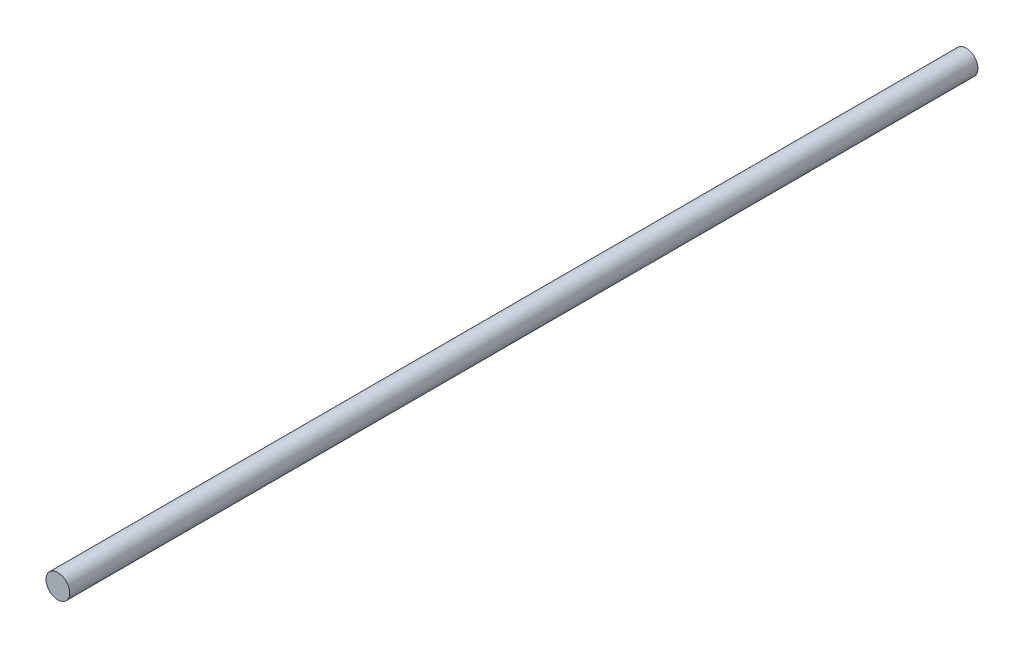
ISO-10303-21;
HEADER;
FILE_DESCRIPTION(('STEP AP214'),'2;1');
FILE_NAME('part.step','',(''),(''),'','','');
FILE_SCHEMA(('AUTOMOTIVE_DESIGN { 1 0 10303 214 1 1 1 1 }'));
ENDSEC;
DATA;
#1=APPLICATION_CONTEXT('core data for automotive mechanical design processes');
#2=APPLICATION_PROTOCOL_DEFINITION('international standard','automotive_design',2000,#1);
#3=PRODUCT_CONTEXT('',#1,'mechanical');
#4=PRODUCT('Part','Part','',(#3));
#5=PRODUCT_RELATED_PRODUCT_CATEGORY('part','',(#4));
#6=PRODUCT_DEFINITION_FORMATION('','',#4);
#7=PRODUCT_DEFINITION_CONTEXT('part definition',#1,'design');
#8=PRODUCT_DEFINITION('design','',#6,#7);
#9=PRODUCT_DEFINITION_SHAPE('','',#8);
#10=(LENGTH_UNIT() NAMED_UNIT(*) SI_UNIT(.MILLI.,.METRE.));
#11=(NAMED_UNIT(*) PLANE_ANGLE_UNIT() SI_UNIT($,.RADIAN.));
#12=(NAMED_UNIT(*) SI_UNIT($,.STERADIAN.) SOLID_ANGLE_UNIT());
#13=UNCERTAINTY_MEASURE_WITH_UNIT(LENGTH_MEASURE(1.E-05),#10,'distance_accuracy_value','');
#14=(GEOMETRIC_REPRESENTATION_CONTEXT(3) GLOBAL_UNCERTAINTY_ASSIGNED_CONTEXT((#13)) GLOBAL_UNIT_ASSIGNED_CONTEXT((#10,
#11,#12)) REPRESENTATION_CONTEXT('',''));
#15=CARTESIAN_POINT('',(0.,0.,0.));
#16=DIRECTION('',(0.,0.,1.));
#17=DIRECTION('',(1.,0.,0.));
#18=AXIS2_PLACEMENT_3D('',#15,#16,#17);
#19=CARTESIAN_POINT('',(0.,0.,1150.));
#20=DIRECTION('',(0.,0.,-1.));
#21=DIRECTION('',(-1.,0.,0.));
#22=AXIS2_PLACEMENT_3D('',#19,#20,#21);
#23=CYLINDRICAL_SURFACE('',#22,15.);
#24=CARTESIAN_POINT('',(0.,0.,1150.));
#25=DIRECTION('',(0.,0.,1.));
#26=DIRECTION('',(1.,0.,0.));
#27=AXIS2_PLACEMENT_3D('',#24,#25,#26);
#28=CIRCLE('',#27,15.);
#29=CARTESIAN_POINT('',(15.,0.,1150.));
#30=VERTEX_POINT('',#29);
#31=EDGE_CURVE('E10',#30,#30,#28,.T.);
#32=ORIENTED_EDGE('',*,*,#31,.F.);
#33=EDGE_LOOP('',(#32));
#34=FACE_BOUND('',#33,.T.);
#35=CARTESIAN_POINT('',(0.,0.,0.));
#36=DIRECTION('',(0.,0.,1.));
#37=DIRECTION('',(1.,0.,0.));
#38=AXIS2_PLACEMENT_3D('',#35,#36,#37);
#39=CIRCLE('',#38,15.);
#40=CARTESIAN_POINT('',(15.,0.,0.));
#41=VERTEX_POINT('',#40);
#42=EDGE_CURVE('E34',#41,#41,#39,.T.);
#43=ORIENTED_EDGE('',*,*,#42,.T.);
#44=EDGE_LOOP('',(#43));
#45=FACE_BOUND('',#44,.T.);
#46=ADVANCED_FACE('F31',(#34,#45),#23,.T.);
#47=CARTESIAN_POINT('',(0.,0.,1150.));
#48=DIRECTION('',(0.,0.,1.));
#49=DIRECTION('',(1.,0.,0.));
#50=AXIS2_PLACEMENT_3D('',#47,#48,#49);
#51=PLANE('',#50);
#52=ORIENTED_EDGE('',*,*,#31,.T.);
#53=EDGE_LOOP('',(#52));
#54=FACE_BOUND('',#53,.T.);
#55=ADVANCED_FACE('F46',(#54),#51,.T.);
#56=CARTESIAN_POINT('',(0.,0.,0.));
#57=DIRECTION('',(0.,0.,1.));
#58=DIRECTION('',(1.,0.,0.));
#59=AXIS2_PLACEMENT_3D('',#56,#57,#58);
#60=PLANE('',#59);
#61=ORIENTED_EDGE('',*,*,#42,.F.);
#62=EDGE_LOOP('',(#61));
#63=FACE_BOUND('',#62,.T.);
#64=ADVANCED_FACE('F44',(#63),#60,.F.);
#65=CLOSED_SHELL('',(#46,#55,#64));
#66=MANIFOLD_SOLID_BREP('B2',#65);
#67=ADVANCED_BREP_SHAPE_REPRESENTATION('',(#18,#66),#14);
#68=SHAPE_DEFINITION_REPRESENTATION(#9,#67);
ENDSEC;
END-ISO-10303-21;
